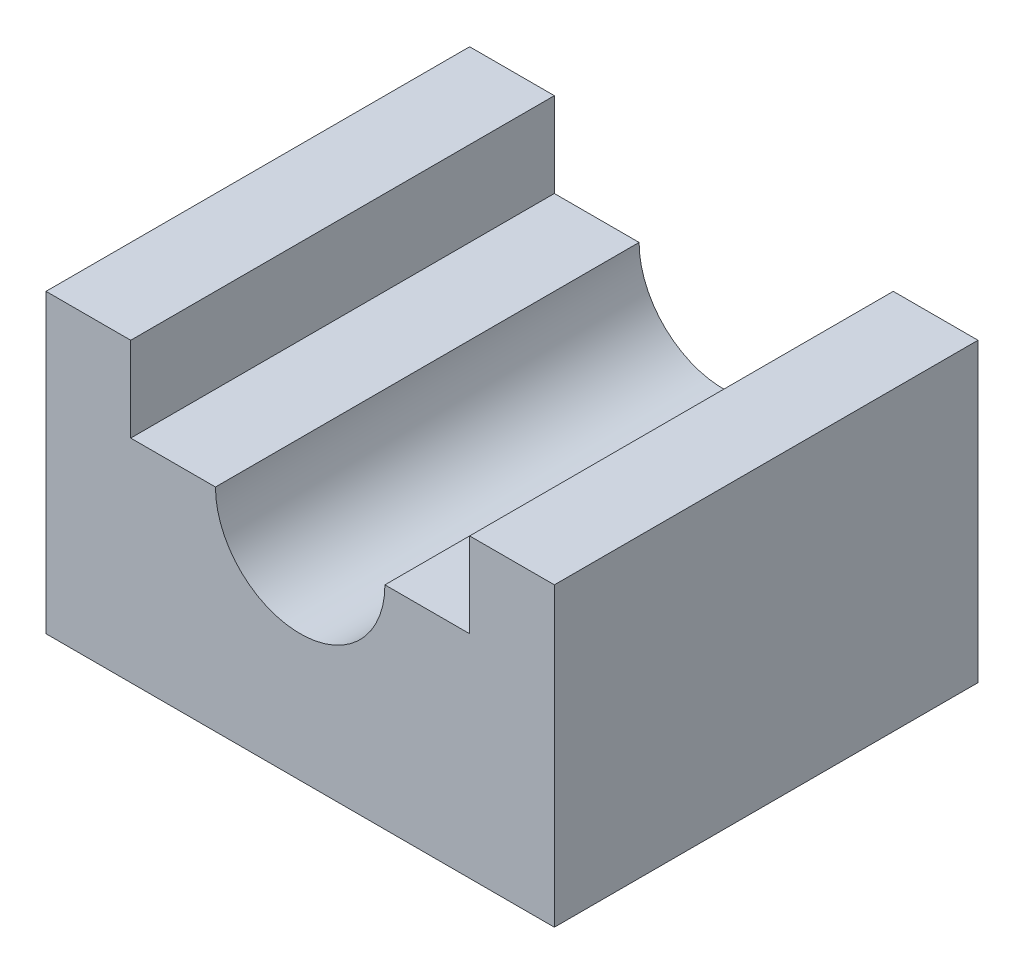
ISO-10303-21;
HEADER;
FILE_DESCRIPTION(('STEP AP214'),'2;1');
FILE_NAME('part.step','',(''),(''),'','','');
FILE_SCHEMA(('AUTOMOTIVE_DESIGN { 1 0 10303 214 1 1 1 1 }'));
ENDSEC;
DATA;
#1=APPLICATION_CONTEXT('core data for automotive mechanical design processes');
#2=APPLICATION_PROTOCOL_DEFINITION('international standard','automotive_design',2000,#1);
#3=PRODUCT_CONTEXT('',#1,'mechanical');
#4=PRODUCT('Part','Part','',(#3));
#5=PRODUCT_RELATED_PRODUCT_CATEGORY('part','',(#4));
#6=PRODUCT_DEFINITION_FORMATION('','',#4);
#7=PRODUCT_DEFINITION_CONTEXT('part definition',#1,'design');
#8=PRODUCT_DEFINITION('design','',#6,#7);
#9=PRODUCT_DEFINITION_SHAPE('','',#8);
#10=(LENGTH_UNIT() NAMED_UNIT(*) SI_UNIT(.MILLI.,.METRE.));
#11=(NAMED_UNIT(*) PLANE_ANGLE_UNIT() SI_UNIT($,.RADIAN.));
#12=(NAMED_UNIT(*) SI_UNIT($,.STERADIAN.) SOLID_ANGLE_UNIT());
#13=UNCERTAINTY_MEASURE_WITH_UNIT(LENGTH_MEASURE(1.E-05),#10,'distance_accuracy_value','');
#14=(GEOMETRIC_REPRESENTATION_CONTEXT(3) GLOBAL_UNCERTAINTY_ASSIGNED_CONTEXT((#13)) GLOBAL_UNIT_ASSIGNED_CONTEXT((#10,
#11,#12)) REPRESENTATION_CONTEXT('',''));
#15=CARTESIAN_POINT('',(0.,0.,0.));
#16=DIRECTION('',(0.,0.,1.));
#17=DIRECTION('',(1.,0.,0.));
#18=AXIS2_PLACEMENT_3D('',#15,#16,#17);
#19=CARTESIAN_POINT('',(30.,35.,50.));
#20=DIRECTION('',(-1.,0.,0.));
#21=DIRECTION('',(0.,-1.,0.));
#22=AXIS2_PLACEMENT_3D('',#19,#20,#21);
#23=PLANE('',#22);
#24=DIRECTION('',(0.,1.,0.));
#25=VECTOR('',#24,1.);
#26=CARTESIAN_POINT('',(30.,35.,0.));
#27=LINE('',#26,#25);
#28=CARTESIAN_POINT('',(30.,0.,0.));
#29=VERTEX_POINT('',#28);
#30=CARTESIAN_POINT('',(30.,35.,0.));
#31=VERTEX_POINT('',#30);
#32=EDGE_CURVE('E145',#29,#31,#27,.T.);
#33=ORIENTED_EDGE('',*,*,#32,.T.);
#34=DIRECTION('',(0.,0.,-1.));
#35=VECTOR('',#34,1.);
#36=CARTESIAN_POINT('',(30.,35.,50.));
#37=LINE('',#36,#35);
#38=CARTESIAN_POINT('',(30.,35.,50.));
#39=VERTEX_POINT('',#38);
#40=EDGE_CURVE('E11',#39,#31,#37,.T.);
#41=ORIENTED_EDGE('',*,*,#40,.F.);
#42=DIRECTION('',(0.,1.,0.));
#43=VECTOR('',#42,1.);
#44=CARTESIAN_POINT('',(30.,35.,50.));
#45=LINE('',#44,#43);
#46=CARTESIAN_POINT('',(30.,0.,50.));
#47=VERTEX_POINT('',#46);
#48=EDGE_CURVE('E163',#47,#39,#45,.T.);
#49=ORIENTED_EDGE('',*,*,#48,.F.);
#50=DIRECTION('',(0.,0.,-1.));
#51=VECTOR('',#50,1.);
#52=CARTESIAN_POINT('',(30.,0.,50.));
#53=LINE('',#52,#51);
#54=EDGE_CURVE('E141',#47,#29,#53,.T.);
#55=ORIENTED_EDGE('',*,*,#54,.T.);
#56=EDGE_LOOP('',(#33,#41,#49,#55));
#57=FACE_BOUND('',#56,.T.);
#58=ADVANCED_FACE('F37',(#57),#23,.F.);
#59=CARTESIAN_POINT('',(20.,35.,50.));
#60=DIRECTION('',(0.,-1.,0.));
#61=DIRECTION('',(1.,0.,0.));
#62=AXIS2_PLACEMENT_3D('',#59,#60,#61);
#63=PLANE('',#62);
#64=DIRECTION('',(-1.,0.,0.));
#65=VECTOR('',#64,1.);
#66=CARTESIAN_POINT('',(20.,35.,0.));
#67=LINE('',#66,#65);
#68=CARTESIAN_POINT('',(20.,35.,0.));
#69=VERTEX_POINT('',#68);
#70=EDGE_CURVE('E148',#31,#69,#67,.T.);
#71=ORIENTED_EDGE('',*,*,#70,.T.);
#72=DIRECTION('',(0.,0.,-1.));
#73=VECTOR('',#72,1.);
#74=CARTESIAN_POINT('',(20.,35.,50.));
#75=LINE('',#74,#73);
#76=CARTESIAN_POINT('',(20.,35.,50.));
#77=VERTEX_POINT('',#76);
#78=EDGE_CURVE('E45',#77,#69,#75,.T.);
#79=ORIENTED_EDGE('',*,*,#78,.F.);
#80=DIRECTION('',(-1.,0.,0.));
#81=VECTOR('',#80,1.);
#82=CARTESIAN_POINT('',(20.,35.,50.));
#83=LINE('',#82,#81);
#84=EDGE_CURVE('E102',#39,#77,#83,.T.);
#85=ORIENTED_EDGE('',*,*,#84,.F.);
#86=ORIENTED_EDGE('',*,*,#40,.T.);
#87=EDGE_LOOP('',(#71,#79,#85,#86));
#88=FACE_BOUND('',#87,.T.);
#89=ADVANCED_FACE('F212',(#88),#63,.F.);
#90=CARTESIAN_POINT('',(20.,25.,50.));
#91=DIRECTION('',(1.,0.,0.));
#92=DIRECTION('',(0.,0.,-1.));
#93=AXIS2_PLACEMENT_3D('',#90,#91,#92);
#94=PLANE('',#93);
#95=DIRECTION('',(0.,-1.,0.));
#96=VECTOR('',#95,1.);
#97=CARTESIAN_POINT('',(20.,25.,0.));
#98=LINE('',#97,#96);
#99=CARTESIAN_POINT('',(20.,25.,0.));
#100=VERTEX_POINT('',#99);
#101=EDGE_CURVE('E150',#69,#100,#98,.T.);
#102=ORIENTED_EDGE('',*,*,#101,.T.);
#103=DIRECTION('',(0.,0.,-1.));
#104=VECTOR('',#103,1.);
#105=CARTESIAN_POINT('',(20.,25.,50.));
#106=LINE('',#105,#104);
#107=CARTESIAN_POINT('',(20.,25.,50.));
#108=VERTEX_POINT('',#107);
#109=EDGE_CURVE('E176',#108,#100,#106,.T.);
#110=ORIENTED_EDGE('',*,*,#109,.F.);
#111=DIRECTION('',(0.,-1.,0.));
#112=VECTOR('',#111,1.);
#113=CARTESIAN_POINT('',(20.,25.,50.));
#114=LINE('',#113,#112);
#115=EDGE_CURVE('E184',#77,#108,#114,.T.);
#116=ORIENTED_EDGE('',*,*,#115,.F.);
#117=ORIENTED_EDGE('',*,*,#78,.T.);
#118=EDGE_LOOP('',(#102,#110,#116,#117));
#119=FACE_BOUND('',#118,.T.);
#120=ADVANCED_FACE('F182',(#119),#94,.F.);
#121=CARTESIAN_POINT('',(9.99999999999999,25.,50.));
#122=DIRECTION('',(0.,-1.,0.));
#123=DIRECTION('',(0.,0.,-1.));
#124=AXIS2_PLACEMENT_3D('',#121,#122,#123);
#125=PLANE('',#124);
#126=DIRECTION('',(-1.,0.,0.));
#127=VECTOR('',#126,1.);
#128=CARTESIAN_POINT('',(9.99999999999999,25.,0.));
#129=LINE('',#128,#127);
#130=CARTESIAN_POINT('',(9.99999999999999,25.,0.));
#131=VERTEX_POINT('',#130);
#132=EDGE_CURVE('E152',#100,#131,#129,.T.);
#133=ORIENTED_EDGE('',*,*,#132,.T.);
#134=DIRECTION('',(0.,0.,-1.));
#135=VECTOR('',#134,1.);
#136=CARTESIAN_POINT('',(9.99999999999999,25.,50.));
#137=LINE('',#136,#135);
#138=CARTESIAN_POINT('',(9.99999999999999,25.,50.));
#139=VERTEX_POINT('',#138);
#140=EDGE_CURVE('E173',#139,#131,#137,.T.);
#141=ORIENTED_EDGE('',*,*,#140,.F.);
#142=DIRECTION('',(-1.,0.,0.));
#143=VECTOR('',#142,1.);
#144=CARTESIAN_POINT('',(9.99999999999999,25.,50.));
#145=LINE('',#144,#143);
#146=EDGE_CURVE('E202',#108,#139,#145,.T.);
#147=ORIENTED_EDGE('',*,*,#146,.F.);
#148=ORIENTED_EDGE('',*,*,#109,.T.);
#149=EDGE_LOOP('',(#133,#141,#147,#148));
#150=FACE_BOUND('',#149,.T.);
#151=ADVANCED_FACE('F193',(#150),#125,.F.);
#152=CARTESIAN_POINT('',(0.,25.,50.));
#153=DIRECTION('',(0.,0.,-1.));
#154=DIRECTION('',(-1.,0.,0.));
#155=AXIS2_PLACEMENT_3D('',#152,#153,#154);
#156=CYLINDRICAL_SURFACE('',#155,10.);
#157=CARTESIAN_POINT('',(0.,25.,0.));
#158=DIRECTION('',(0.,0.,-1.));
#159=DIRECTION('',(1.,0.,0.));
#160=AXIS2_PLACEMENT_3D('',#157,#158,#159);
#161=CIRCLE('',#160,10.);
#162=CARTESIAN_POINT('',(-10.,25.,0.));
#163=VERTEX_POINT('',#162);
#164=EDGE_CURVE('E154',#131,#163,#161,.T.);
#165=ORIENTED_EDGE('',*,*,#164,.T.);
#166=DIRECTION('',(0.,0.,-1.));
#167=VECTOR('',#166,1.);
#168=CARTESIAN_POINT('',(-10.,25.,50.));
#169=LINE('',#168,#167);
#170=CARTESIAN_POINT('',(-10.,25.,50.));
#171=VERTEX_POINT('',#170);
#172=EDGE_CURVE('E170',#171,#163,#169,.T.);
#173=ORIENTED_EDGE('',*,*,#172,.F.);
#174=CARTESIAN_POINT('',(0.,25.,50.));
#175=DIRECTION('',(0.,0.,-1.));
#176=DIRECTION('',(1.,0.,0.));
#177=AXIS2_PLACEMENT_3D('',#174,#175,#176);
#178=CIRCLE('',#177,10.);
#179=EDGE_CURVE('E199',#139,#171,#178,.T.);
#180=ORIENTED_EDGE('',*,*,#179,.F.);
#181=ORIENTED_EDGE('',*,*,#140,.T.);
#182=EDGE_LOOP('',(#165,#173,#180,#181));
#183=FACE_BOUND('',#182,.T.);
#184=ADVANCED_FACE('F197',(#183),#156,.F.);
#185=CARTESIAN_POINT('',(-20.,25.,50.));
#186=DIRECTION('',(0.,-1.,0.));
#187=DIRECTION('',(1.,0.,0.));
#188=AXIS2_PLACEMENT_3D('',#185,#186,#187);
#189=PLANE('',#188);
#190=DIRECTION('',(-1.,0.,0.));
#191=VECTOR('',#190,1.);
#192=CARTESIAN_POINT('',(-20.,25.,0.));
#193=LINE('',#192,#191);
#194=CARTESIAN_POINT('',(-20.,25.,0.));
#195=VERTEX_POINT('',#194);
#196=EDGE_CURVE('E156',#163,#195,#193,.T.);
#197=ORIENTED_EDGE('',*,*,#196,.T.);
#198=DIRECTION('',(0.,0.,-1.));
#199=VECTOR('',#198,1.);
#200=CARTESIAN_POINT('',(-20.,25.,50.));
#201=LINE('',#200,#199);
#202=CARTESIAN_POINT('',(-20.,25.,50.));
#203=VERTEX_POINT('',#202);
#204=EDGE_CURVE('E167',#203,#195,#201,.T.);
#205=ORIENTED_EDGE('',*,*,#204,.F.);
#206=DIRECTION('',(-1.,0.,0.));
#207=VECTOR('',#206,1.);
#208=CARTESIAN_POINT('',(-20.,25.,50.));
#209=LINE('',#208,#207);
#210=EDGE_CURVE('E201',#171,#203,#209,.T.);
#211=ORIENTED_EDGE('',*,*,#210,.F.);
#212=ORIENTED_EDGE('',*,*,#172,.T.);
#213=EDGE_LOOP('',(#197,#205,#211,#212));
#214=FACE_BOUND('',#213,.T.);
#215=ADVANCED_FACE('F224',(#214),#189,.F.);
#216=CARTESIAN_POINT('',(-20.,35.,50.));
#217=DIRECTION('',(-1.,0.,0.));
#218=DIRECTION('',(0.,0.,1.));
#219=AXIS2_PLACEMENT_3D('',#216,#217,#218);
#220=PLANE('',#219);
#221=DIRECTION('',(0.,1.,0.));
#222=VECTOR('',#221,1.);
#223=CARTESIAN_POINT('',(-20.,35.,0.));
#224=LINE('',#223,#222);
#225=CARTESIAN_POINT('',(-20.,35.,0.));
#226=VERTEX_POINT('',#225);
#227=EDGE_CURVE('E158',#195,#226,#224,.T.);
#228=ORIENTED_EDGE('',*,*,#227,.T.);
#229=DIRECTION('',(0.,0.,-1.));
#230=VECTOR('',#229,1.);
#231=CARTESIAN_POINT('',(-20.,35.,50.));
#232=LINE('',#231,#230);
#233=CARTESIAN_POINT('',(-20.,35.,50.));
#234=VERTEX_POINT('',#233);
#235=EDGE_CURVE('E136',#234,#226,#232,.T.);
#236=ORIENTED_EDGE('',*,*,#235,.F.);
#237=DIRECTION('',(0.,1.,0.));
#238=VECTOR('',#237,1.);
#239=CARTESIAN_POINT('',(-20.,35.,50.));
#240=LINE('',#239,#238);
#241=EDGE_CURVE('E127',#203,#234,#240,.T.);
#242=ORIENTED_EDGE('',*,*,#241,.F.);
#243=ORIENTED_EDGE('',*,*,#204,.T.);
#244=EDGE_LOOP('',(#228,#236,#242,#243));
#245=FACE_BOUND('',#244,.T.);
#246=ADVANCED_FACE('F227',(#245),#220,.F.);
#247=CARTESIAN_POINT('',(-30.,35.,50.));
#248=DIRECTION('',(0.,-1.,0.));
#249=DIRECTION('',(0.,0.,-1.));
#250=AXIS2_PLACEMENT_3D('',#247,#248,#249);
#251=PLANE('',#250);
#252=DIRECTION('',(-1.,0.,0.));
#253=VECTOR('',#252,1.);
#254=CARTESIAN_POINT('',(-30.,35.,0.));
#255=LINE('',#254,#253);
#256=CARTESIAN_POINT('',(-30.,35.,0.));
#257=VERTEX_POINT('',#256);
#258=EDGE_CURVE('E135',#226,#257,#255,.T.);
#259=ORIENTED_EDGE('',*,*,#258,.T.);
#260=DIRECTION('',(0.,0.,-1.));
#261=VECTOR('',#260,1.);
#262=CARTESIAN_POINT('',(-30.,35.,50.));
#263=LINE('',#262,#261);
#264=CARTESIAN_POINT('',(-30.,35.,50.));
#265=VERTEX_POINT('',#264);
#266=EDGE_CURVE('E132',#265,#257,#263,.T.);
#267=ORIENTED_EDGE('',*,*,#266,.F.);
#268=DIRECTION('',(-1.,0.,0.));
#269=VECTOR('',#268,1.);
#270=CARTESIAN_POINT('',(-30.,35.,50.));
#271=LINE('',#270,#269);
#272=EDGE_CURVE('E121',#234,#265,#271,.T.);
#273=ORIENTED_EDGE('',*,*,#272,.F.);
#274=ORIENTED_EDGE('',*,*,#235,.T.);
#275=EDGE_LOOP('',(#259,#267,#273,#274));
#276=FACE_BOUND('',#275,.T.);
#277=ADVANCED_FACE('F133',(#276),#251,.F.);
#278=CARTESIAN_POINT('',(-30.,35.,50.));
#279=DIRECTION('',(1.,0.,0.));
#280=DIRECTION('',(0.,1.,0.));
#281=AXIS2_PLACEMENT_3D('',#278,#279,#280);
#282=PLANE('',#281);
#283=DIRECTION('',(0.,-1.,0.));
#284=VECTOR('',#283,1.);
#285=CARTESIAN_POINT('',(-30.,35.,0.));
#286=LINE('',#285,#284);
#287=CARTESIAN_POINT('',(-30.,0.,0.));
#288=VERTEX_POINT('',#287);
#289=EDGE_CURVE('E88',#257,#288,#286,.T.);
#290=ORIENTED_EDGE('',*,*,#289,.T.);
#291=DIRECTION('',(0.,0.,-1.));
#292=VECTOR('',#291,1.);
#293=CARTESIAN_POINT('',(-30.,0.,50.));
#294=LINE('',#293,#292);
#295=CARTESIAN_POINT('',(-30.,0.,50.));
#296=VERTEX_POINT('',#295);
#297=EDGE_CURVE('E137',#296,#288,#294,.T.);
#298=ORIENTED_EDGE('',*,*,#297,.F.);
#299=DIRECTION('',(0.,-1.,0.));
#300=VECTOR('',#299,1.);
#301=CARTESIAN_POINT('',(-30.,35.,50.));
#302=LINE('',#301,#300);
#303=EDGE_CURVE('E125',#265,#296,#302,.T.);
#304=ORIENTED_EDGE('',*,*,#303,.F.);
#305=ORIENTED_EDGE('',*,*,#266,.T.);
#306=EDGE_LOOP('',(#290,#298,#304,#305));
#307=FACE_BOUND('',#306,.T.);
#308=ADVANCED_FACE('F139',(#307),#282,.F.);
#309=CARTESIAN_POINT('',(-30.,0.,50.));
#310=DIRECTION('',(0.,1.,0.));
#311=DIRECTION('',(0.,0.,1.));
#312=AXIS2_PLACEMENT_3D('',#309,#310,#311);
#313=PLANE('',#312);
#314=DIRECTION('',(1.,0.,0.));
#315=VECTOR('',#314,1.);
#316=CARTESIAN_POINT('',(-30.,0.,0.));
#317=LINE('',#316,#315);
#318=EDGE_CURVE('E94',#288,#29,#317,.T.);
#319=ORIENTED_EDGE('',*,*,#318,.T.);
#320=ORIENTED_EDGE('',*,*,#54,.F.);
#321=DIRECTION('',(1.,0.,0.));
#322=VECTOR('',#321,1.);
#323=CARTESIAN_POINT('',(-30.,0.,50.));
#324=LINE('',#323,#322);
#325=EDGE_CURVE('E53',#296,#47,#324,.T.);
#326=ORIENTED_EDGE('',*,*,#325,.F.);
#327=ORIENTED_EDGE('',*,*,#297,.T.);
#328=EDGE_LOOP('',(#319,#320,#326,#327));
#329=FACE_BOUND('',#328,.T.);
#330=ADVANCED_FACE('F236',(#329),#313,.F.);
#331=CARTESIAN_POINT('',(0.,25.,50.));
#332=DIRECTION('',(0.,0.,1.));
#333=DIRECTION('',(1.,0.,0.));
#334=AXIS2_PLACEMENT_3D('',#331,#332,#333);
#335=PLANE('',#334);
#336=ORIENTED_EDGE('',*,*,#48,.T.);
#337=ORIENTED_EDGE('',*,*,#84,.T.);
#338=ORIENTED_EDGE('',*,*,#115,.T.);
#339=ORIENTED_EDGE('',*,*,#146,.T.);
#340=ORIENTED_EDGE('',*,*,#179,.T.);
#341=ORIENTED_EDGE('',*,*,#210,.T.);
#342=ORIENTED_EDGE('',*,*,#241,.T.);
#343=ORIENTED_EDGE('',*,*,#272,.T.);
#344=ORIENTED_EDGE('',*,*,#303,.T.);
#345=ORIENTED_EDGE('',*,*,#325,.T.);
#346=EDGE_LOOP('',(#336,#337,#338,#339,#340,#341,#342,#343,#344,#345));
#347=FACE_BOUND('',#346,.T.);
#348=ADVANCED_FACE('F123',(#347),#335,.T.);
#349=CARTESIAN_POINT('',(0.,25.,0.));
#350=DIRECTION('',(0.,0.,1.));
#351=DIRECTION('',(1.,0.,0.));
#352=AXIS2_PLACEMENT_3D('',#349,#350,#351);
#353=PLANE('',#352);
#354=ORIENTED_EDGE('',*,*,#32,.F.);
#355=ORIENTED_EDGE('',*,*,#318,.F.);
#356=ORIENTED_EDGE('',*,*,#289,.F.);
#357=ORIENTED_EDGE('',*,*,#258,.F.);
#358=ORIENTED_EDGE('',*,*,#227,.F.);
#359=ORIENTED_EDGE('',*,*,#196,.F.);
#360=ORIENTED_EDGE('',*,*,#164,.F.);
#361=ORIENTED_EDGE('',*,*,#132,.F.);
#362=ORIENTED_EDGE('',*,*,#101,.F.);
#363=ORIENTED_EDGE('',*,*,#70,.F.);
#364=EDGE_LOOP('',(#354,#355,#356,#357,#358,#359,#360,#361,#362,#363));
#365=FACE_BOUND('',#364,.T.);
#366=ADVANCED_FACE('F188',(#365),#353,.F.);
#367=CLOSED_SHELL('',(#58,#89,#120,#151,#184,#215,#246,#277,#308,#330,#348,#366));
#368=MANIFOLD_SOLID_BREP('B2',#367);
#369=ADVANCED_BREP_SHAPE_REPRESENTATION('',(#18,#368),#14);
#370=SHAPE_DEFINITION_REPRESENTATION(#9,#369);
ENDSEC;
END-ISO-10303-21;
